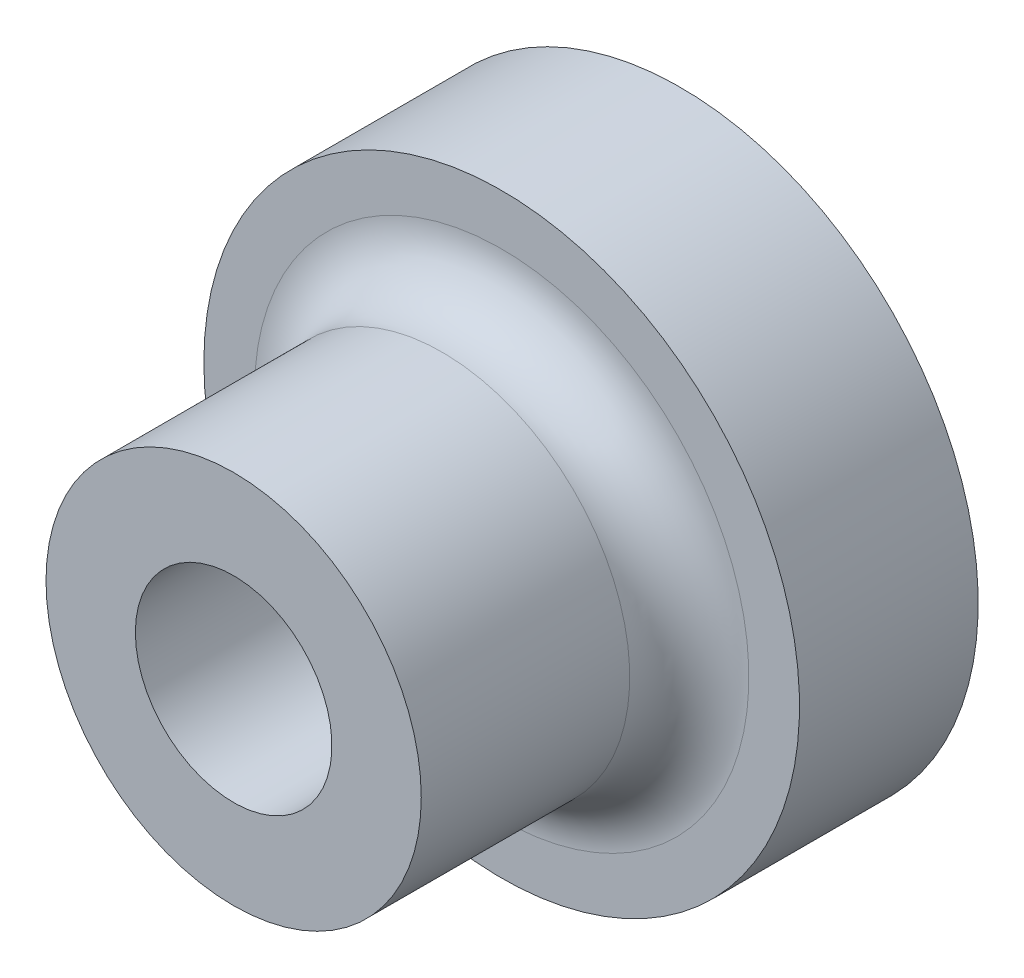
ISO-10303-21;
HEADER;
FILE_DESCRIPTION(('STEP AP214'),'2;1');
FILE_NAME('part.step','',(''),(''),'','','');
FILE_SCHEMA(('AUTOMOTIVE_DESIGN { 1 0 10303 214 1 1 1 1 }'));
ENDSEC;
DATA;
#1=APPLICATION_CONTEXT('core data for automotive mechanical design processes');
#2=APPLICATION_PROTOCOL_DEFINITION('international standard','automotive_design',2000,#1);
#3=PRODUCT_CONTEXT('',#1,'mechanical');
#4=PRODUCT('Part','Part','',(#3));
#5=PRODUCT_RELATED_PRODUCT_CATEGORY('part','',(#4));
#6=PRODUCT_DEFINITION_FORMATION('','',#4);
#7=PRODUCT_DEFINITION_CONTEXT('part definition',#1,'design');
#8=PRODUCT_DEFINITION('design','',#6,#7);
#9=PRODUCT_DEFINITION_SHAPE('','',#8);
#10=(LENGTH_UNIT() NAMED_UNIT(*) SI_UNIT(.MILLI.,.METRE.));
#11=(NAMED_UNIT(*) PLANE_ANGLE_UNIT() SI_UNIT($,.RADIAN.));
#12=(NAMED_UNIT(*) SI_UNIT($,.STERADIAN.) SOLID_ANGLE_UNIT());
#13=UNCERTAINTY_MEASURE_WITH_UNIT(LENGTH_MEASURE(1.E-05),#10,'distance_accuracy_value','');
#14=(GEOMETRIC_REPRESENTATION_CONTEXT(3) GLOBAL_UNCERTAINTY_ASSIGNED_CONTEXT((#13)) GLOBAL_UNIT_ASSIGNED_CONTEXT((#10,
#11,#12)) REPRESENTATION_CONTEXT('',''));
#15=CARTESIAN_POINT('',(0.,0.,0.));
#16=DIRECTION('',(0.,0.,1.));
#17=DIRECTION('',(1.,0.,0.));
#18=AXIS2_PLACEMENT_3D('',#15,#16,#17);
#19=CARTESIAN_POINT('',(0.,0.,4.5));
#20=DIRECTION('',(0.,0.,-1.));
#21=DIRECTION('',(-1.,0.,0.));
#22=AXIS2_PLACEMENT_3D('',#19,#20,#21);
#23=CYLINDRICAL_SURFACE('',#22,3.15);
#24=CARTESIAN_POINT('',(0.,0.,1.));
#25=DIRECTION('',(0.,0.,-1.));
#26=DIRECTION('',(-1.,0.,0.));
#27=AXIS2_PLACEMENT_3D('',#24,#25,#26);
#28=CIRCLE('',#27,3.15);
#29=CARTESIAN_POINT('',(-3.15,0.,1.));
#30=VERTEX_POINT('',#29);
#31=EDGE_CURVE('E42',#30,#30,#28,.F.);
#32=ORIENTED_EDGE('',*,*,#31,.T.);
#33=EDGE_LOOP('',(#32));
#34=FACE_BOUND('',#33,.T.);
#35=CARTESIAN_POINT('',(0.,0.,4.5));
#36=DIRECTION('',(0.,0.,1.));
#37=DIRECTION('',(1.,0.,0.));
#38=AXIS2_PLACEMENT_3D('',#35,#36,#37);
#39=CIRCLE('',#38,3.15);
#40=CARTESIAN_POINT('',(3.15,0.,4.5));
#41=VERTEX_POINT('',#40);
#42=EDGE_CURVE('E46',#41,#41,#39,.T.);
#43=ORIENTED_EDGE('',*,*,#42,.F.);
#44=EDGE_LOOP('',(#43));
#45=FACE_BOUND('',#44,.T.);
#46=ADVANCED_FACE('F35',(#34,#45),#23,.T.);
#47=CARTESIAN_POINT('',(0.,0.,4.5));
#48=DIRECTION('',(0.,0.,1.));
#49=DIRECTION('',(1.,0.,0.));
#50=AXIS2_PLACEMENT_3D('',#47,#48,#49);
#51=PLANE('',#50);
#52=CARTESIAN_POINT('',(0.,0.,4.5));
#53=DIRECTION('',(0.,0.,1.));
#54=DIRECTION('',(1.,0.,0.));
#55=AXIS2_PLACEMENT_3D('',#52,#53,#54);
#56=CIRCLE('',#55,1.65);
#57=CARTESIAN_POINT('',(-1.65,0.,4.5));
#58=VERTEX_POINT('',#57);
#59=EDGE_CURVE('E59',#58,#58,#56,.F.);
#60=ORIENTED_EDGE('',*,*,#59,.T.);
#61=EDGE_LOOP('',(#60));
#62=FACE_BOUND('',#61,.T.);
#63=ORIENTED_EDGE('',*,*,#42,.T.);
#64=EDGE_LOOP('',(#63));
#65=FACE_BOUND('',#64,.T.);
#66=ADVANCED_FACE('F77',(#62,#65),#51,.T.);
#67=CARTESIAN_POINT('',(0.,0.,-3.));
#68=DIRECTION('',(0.,0.,1.));
#69=DIRECTION('',(1.,0.,0.));
#70=AXIS2_PLACEMENT_3D('',#67,#68,#69);
#71=CYLINDRICAL_SURFACE('',#70,5.);
#72=CARTESIAN_POINT('',(0.,0.,-3.));
#73=DIRECTION('',(0.,0.,-1.));
#74=DIRECTION('',(-1.,0.,0.));
#75=AXIS2_PLACEMENT_3D('',#72,#73,#74);
#76=CIRCLE('',#75,5.);
#77=CARTESIAN_POINT('',(-5.,0.,-3.));
#78=VERTEX_POINT('',#77);
#79=EDGE_CURVE('E50',#78,#78,#76,.T.);
#80=ORIENTED_EDGE('',*,*,#79,.F.);
#81=EDGE_LOOP('',(#80));
#82=FACE_BOUND('',#81,.T.);
#83=CARTESIAN_POINT('',(0.,0.,0.));
#84=DIRECTION('',(0.,0.,-1.));
#85=DIRECTION('',(-1.,0.,0.));
#86=AXIS2_PLACEMENT_3D('',#83,#84,#85);
#87=CIRCLE('',#86,5.);
#88=CARTESIAN_POINT('',(-5.,0.,0.));
#89=VERTEX_POINT('',#88);
#90=EDGE_CURVE('E53',#89,#89,#87,.T.);
#91=ORIENTED_EDGE('',*,*,#90,.T.);
#92=EDGE_LOOP('',(#91));
#93=FACE_BOUND('',#92,.T.);
#94=ADVANCED_FACE('F71',(#82,#93),#71,.T.);
#95=CARTESIAN_POINT('',(0.,0.,-3.));
#96=DIRECTION('',(0.,0.,-1.));
#97=DIRECTION('',(-1.,0.,0.));
#98=AXIS2_PLACEMENT_3D('',#95,#96,#97);
#99=PLANE('',#98);
#100=CARTESIAN_POINT('',(0.,0.,-3.));
#101=DIRECTION('',(0.,0.,-1.));
#102=DIRECTION('',(-1.,0.,0.));
#103=AXIS2_PLACEMENT_3D('',#100,#101,#102);
#104=CIRCLE('',#103,1.65);
#105=CARTESIAN_POINT('',(-1.65,0.,-3.));
#106=VERTEX_POINT('',#105);
#107=EDGE_CURVE('E56',#106,#106,#104,.T.);
#108=ORIENTED_EDGE('',*,*,#107,.F.);
#109=EDGE_LOOP('',(#108));
#110=FACE_BOUND('',#109,.T.);
#111=ORIENTED_EDGE('',*,*,#79,.T.);
#112=EDGE_LOOP('',(#111));
#113=FACE_BOUND('',#112,.T.);
#114=ADVANCED_FACE('F67',(#110,#113),#99,.T.);
#115=CARTESIAN_POINT('',(0.,0.,0.));
#116=DIRECTION('',(0.,0.,-1.));
#117=DIRECTION('',(-1.,0.,0.));
#118=AXIS2_PLACEMENT_3D('',#115,#116,#117);
#119=PLANE('',#118);
#120=CARTESIAN_POINT('',(0.,0.,0.));
#121=DIRECTION('',(0.,0.,-1.));
#122=DIRECTION('',(-1.,0.,0.));
#123=AXIS2_PLACEMENT_3D('',#120,#121,#122);
#124=CIRCLE('',#123,4.15);
#125=CARTESIAN_POINT('',(-4.15,0.,0.));
#126=VERTEX_POINT('',#125);
#127=EDGE_CURVE('E10',#126,#126,#124,.T.);
#128=ORIENTED_EDGE('',*,*,#127,.T.);
#129=EDGE_LOOP('',(#128));
#130=FACE_BOUND('',#129,.T.);
#131=ORIENTED_EDGE('',*,*,#90,.F.);
#132=EDGE_LOOP('',(#131));
#133=FACE_BOUND('',#132,.T.);
#134=ADVANCED_FACE('F70',(#130,#133),#119,.F.);
#135=CARTESIAN_POINT('',(0.,0.,1.));
#136=DIRECTION('',(0.,0.,-1.));
#137=DIRECTION('',(-1.,0.,0.));
#138=AXIS2_PLACEMENT_3D('',#135,#136,#137);
#139=TOROIDAL_SURFACE('',#138,4.15,1.);
#140=ORIENTED_EDGE('',*,*,#127,.F.);
#141=EDGE_LOOP('',(#140));
#142=FACE_BOUND('',#141,.T.);
#143=ORIENTED_EDGE('',*,*,#31,.F.);
#144=EDGE_LOOP('',(#143));
#145=FACE_BOUND('',#144,.T.);
#146=ADVANCED_FACE('F37',(#142,#145),#139,.F.);
#147=CARTESIAN_POINT('',(0.,0.,4.501));
#148=DIRECTION('',(0.,0.,-1.));
#149=DIRECTION('',(-1.,0.,0.));
#150=AXIS2_PLACEMENT_3D('',#147,#148,#149);
#151=CYLINDRICAL_SURFACE('',#150,1.65);
#152=CARTESIAN_POINT('',(-1.65,0.,4.5));
#153=CARTESIAN_POINT('',(-1.65,0.,4.421875));
#154=CARTESIAN_POINT('',(-1.65,0.,4.34375));
#155=CARTESIAN_POINT('',(-1.65,0.,4.1875));
#156=CARTESIAN_POINT('',(-1.65,0.,4.109375));
#157=CARTESIAN_POINT('',(-1.65,0.,3.953125));
#158=CARTESIAN_POINT('',(-1.65,0.,3.875));
#159=CARTESIAN_POINT('',(-1.65,0.,3.71875));
#160=CARTESIAN_POINT('',(-1.65,0.,3.640625));
#161=CARTESIAN_POINT('',(-1.65,0.,3.484375));
#162=CARTESIAN_POINT('',(-1.65,0.,3.40625));
#163=CARTESIAN_POINT('',(-1.65,0.,3.25));
#164=CARTESIAN_POINT('',(-1.65,0.,3.171875));
#165=CARTESIAN_POINT('',(-1.65,0.,3.015625));
#166=CARTESIAN_POINT('',(-1.65,0.,2.9375));
#167=CARTESIAN_POINT('',(-1.65,0.,2.78125));
#168=CARTESIAN_POINT('',(-1.65,0.,2.703125));
#169=CARTESIAN_POINT('',(-1.65,0.,2.546875));
#170=CARTESIAN_POINT('',(-1.65,0.,2.46875));
#171=CARTESIAN_POINT('',(-1.65,0.,2.3125));
#172=CARTESIAN_POINT('',(-1.65,0.,2.234375));
#173=CARTESIAN_POINT('',(-1.65,0.,2.078125));
#174=CARTESIAN_POINT('',(-1.65,0.,2.));
#175=CARTESIAN_POINT('',(-1.65,0.,1.84375));
#176=CARTESIAN_POINT('',(-1.65,0.,1.765625));
#177=CARTESIAN_POINT('',(-1.65,0.,1.609375));
#178=CARTESIAN_POINT('',(-1.65,0.,1.53125));
#179=CARTESIAN_POINT('',(-1.65,0.,1.375));
#180=CARTESIAN_POINT('',(-1.65,0.,1.296875));
#181=CARTESIAN_POINT('',(-1.65,0.,1.140625));
#182=CARTESIAN_POINT('',(-1.65,0.,1.0625));
#183=CARTESIAN_POINT('',(-1.65,0.,0.90625));
#184=CARTESIAN_POINT('',(-1.65,0.,0.828125));
#185=CARTESIAN_POINT('',(-1.65,0.,0.671875));
#186=CARTESIAN_POINT('',(-1.65,0.,0.59375));
#187=CARTESIAN_POINT('',(-1.65,0.,0.4375));
#188=CARTESIAN_POINT('',(-1.65,0.,0.359374999999999));
#189=CARTESIAN_POINT('',(-1.65,0.,0.203125));
#190=CARTESIAN_POINT('',(-1.65,0.,0.125));
#191=CARTESIAN_POINT('',(-1.65,0.,-0.0312499999999992));
#192=CARTESIAN_POINT('',(-1.65,0.,-0.109374999999999));
#193=CARTESIAN_POINT('',(-1.65,0.,-0.265624999999999));
#194=CARTESIAN_POINT('',(-1.65,0.,-0.343749999999999));
#195=CARTESIAN_POINT('',(-1.65,0.,-0.5));
#196=CARTESIAN_POINT('',(-1.65,0.,-0.578125));
#197=CARTESIAN_POINT('',(-1.65,0.,-0.734375));
#198=CARTESIAN_POINT('',(-1.65,0.,-0.8125));
#199=CARTESIAN_POINT('',(-1.65,0.,-0.96875));
#200=CARTESIAN_POINT('',(-1.65,0.,-1.046875));
#201=CARTESIAN_POINT('',(-1.65,0.,-1.203125));
#202=CARTESIAN_POINT('',(-1.65,0.,-1.28125));
#203=CARTESIAN_POINT('',(-1.65,0.,-1.4375));
#204=CARTESIAN_POINT('',(-1.65,0.,-1.515625));
#205=CARTESIAN_POINT('',(-1.65,0.,-1.671875));
#206=CARTESIAN_POINT('',(-1.65,0.,-1.75));
#207=CARTESIAN_POINT('',(-1.65,0.,-1.90625));
#208=CARTESIAN_POINT('',(-1.65,0.,-1.984375));
#209=CARTESIAN_POINT('',(-1.65,0.,-2.140625));
#210=CARTESIAN_POINT('',(-1.65,0.,-2.21875));
#211=CARTESIAN_POINT('',(-1.65,0.,-2.375));
#212=CARTESIAN_POINT('',(-1.65,0.,-2.453125));
#213=CARTESIAN_POINT('',(-1.65,0.,-2.609375));
#214=CARTESIAN_POINT('',(-1.65,0.,-2.6875));
#215=CARTESIAN_POINT('',(-1.65,0.,-2.84375));
#216=CARTESIAN_POINT('',(-1.65,0.,-2.921875));
#217=CARTESIAN_POINT('',(-1.65,0.,-3.));
#218=B_SPLINE_CURVE_WITH_KNOTS('',3,(#152,#153,#154,#155,#156,#157,#158,#159,#160,#161,#162,
#163,#164,#165,#166,#167,#168,#169,#170,#171,#172,#173,#174,#175,#176,#177,#178,#179,#180,#181,
#182,#183,#184,#185,#186,#187,#188,#189,#190,#191,#192,#193,#194,#195,#196,#197,#198,#199,#200,
#201,#202,#203,#204,#205,#206,#207,#208,#209,#210,#211,#212,#213,#214,#215,#216,#217),
.UNSPECIFIED.,.F.,.F.,(4,2,2,2,2,2,2,2,2,2,2,2,2,2,2,2,2,2,2,2,2,2,2,2,2,2,2,2,2,2,2,2,4),(0.,
0.234375,0.46875,0.703125,0.9375,1.171875,1.40625,1.640625,1.875,2.109375,2.34375,2.578125,
2.8125,3.046875,3.28125,3.515625,3.75,3.984375,4.21875,4.453125,4.6875,4.921875,5.15625,
5.390625,5.625,5.859375,6.09375,6.328125,6.5625,6.796875,7.03125,7.265625,7.5),.UNSPECIFIED.);
#219=EDGE_CURVE('BSEAM65',#58,#106,#218,.T.);
#220=ORIENTED_EDGE('',*,*,#59,.F.);
#221=ORIENTED_EDGE('',*,*,#107,.T.);
#222=ORIENTED_EDGE('',*,*,#219,.T.);
#223=ORIENTED_EDGE('',*,*,#219,.F.);
#224=EDGE_LOOP('',(#220,#222,#221,#223));
#225=FACE_BOUND('',#224,.T.);
#226=ADVANCED_FACE('F65',(#225),#151,.F.);
#227=CLOSED_SHELL('',(#46,#66,#94,#114,#134,#146,#226));
#228=MANIFOLD_SOLID_BREP('B2',#227);
#229=ADVANCED_BREP_SHAPE_REPRESENTATION('',(#18,#228),#14);
#230=SHAPE_DEFINITION_REPRESENTATION(#9,#229);
ENDSEC;
END-ISO-10303-21;
